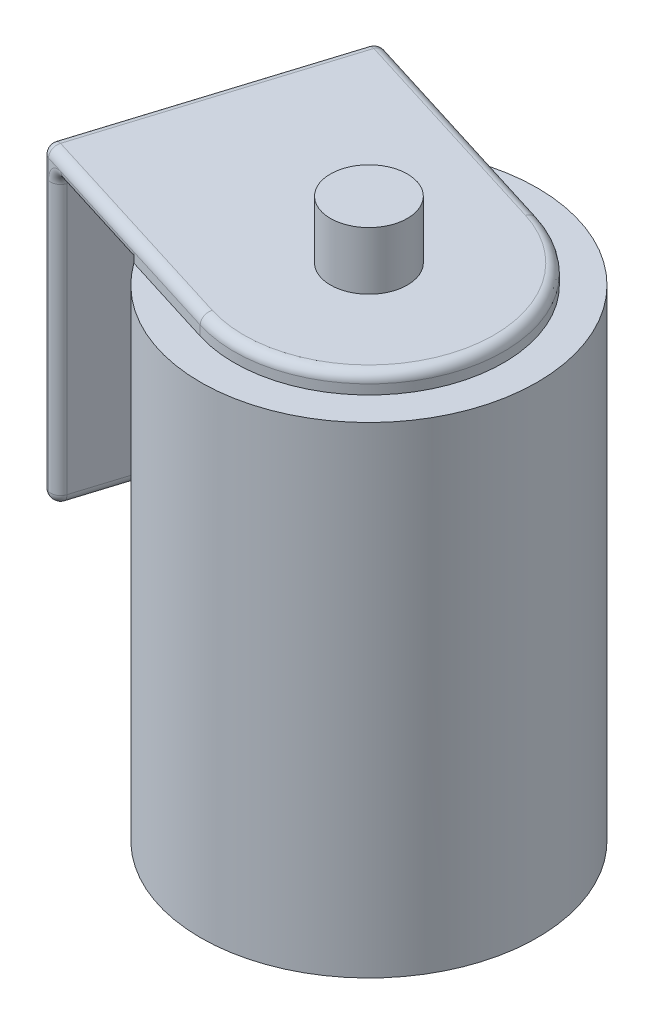
ISO-10303-21;
HEADER;
FILE_DESCRIPTION(('STEP AP214'),'2;1');
FILE_NAME('part.step','',(''),(''),'','','');
FILE_SCHEMA(('AUTOMOTIVE_DESIGN { 1 0 10303 214 1 1 1 1 }'));
ENDSEC;
DATA;
#1=APPLICATION_CONTEXT('core data for automotive mechanical design processes');
#2=APPLICATION_PROTOCOL_DEFINITION('international standard','automotive_design',2000,#1);
#3=PRODUCT_CONTEXT('',#1,'mechanical');
#4=PRODUCT('Part','Part','',(#3));
#5=PRODUCT_RELATED_PRODUCT_CATEGORY('part','',(#4));
#6=PRODUCT_DEFINITION_FORMATION('','',#4);
#7=PRODUCT_DEFINITION_CONTEXT('part definition',#1,'design');
#8=PRODUCT_DEFINITION('design','',#6,#7);
#9=PRODUCT_DEFINITION_SHAPE('','',#8);
#10=(LENGTH_UNIT() NAMED_UNIT(*) SI_UNIT(.MILLI.,.METRE.));
#11=(NAMED_UNIT(*) PLANE_ANGLE_UNIT() SI_UNIT($,.RADIAN.));
#12=(NAMED_UNIT(*) SI_UNIT($,.STERADIAN.) SOLID_ANGLE_UNIT());
#13=UNCERTAINTY_MEASURE_WITH_UNIT(LENGTH_MEASURE(1.E-05),#10,'distance_accuracy_value','');
#14=(GEOMETRIC_REPRESENTATION_CONTEXT(3) GLOBAL_UNCERTAINTY_ASSIGNED_CONTEXT((#13)) GLOBAL_UNIT_ASSIGNED_CONTEXT((#10,
#11,#12)) REPRESENTATION_CONTEXT('',''));
#15=CARTESIAN_POINT('',(0.,0.,0.));
#16=DIRECTION('',(0.,0.,1.));
#17=DIRECTION('',(1.,0.,0.));
#18=AXIS2_PLACEMENT_3D('',#15,#16,#17);
#19=CARTESIAN_POINT('',(-4.1677224270147,52.,13.3652568165134));
#20=DIRECTION('',(0.297694459072478,0.,-0.954661201179531));
#21=DIRECTION('',(-0.954661201179531,0.,-0.297694459072478));
#22=AXIS2_PLACEMENT_3D('',#19,#20,#21);
#23=PLANE('',#22);
#24=DIRECTION('',(0.954661201179531,0.,0.297694459072478));
#25=VECTOR('',#24,1.);
#26=CARTESIAN_POINT('',(-27.0795912553234,51.,6.22058979877396));
#27=LINE('',#26,#25);
#28=CARTESIAN_POINT('',(-4.1677224270147,51.,13.3652568165134));
#29=VERTEX_POINT('',#28);
#30=CARTESIAN_POINT('',(-14.1916650393998,51.,10.2394649962524));
#31=VERTEX_POINT('',#30);
#32=EDGE_CURVE('E192',#29,#31,#27,.F.);
#33=ORIENTED_EDGE('',*,*,#32,.T.);
#34=DIRECTION('',(0.,-1.,0.));
#35=VECTOR('',#34,1.);
#36=CARTESIAN_POINT('',(-14.1916650393998,51.,10.2394649962524));
#37=LINE('',#36,#35);
#38=CARTESIAN_POINT('',(-14.1916650393998,50.,10.2394649962524));
#39=VERTEX_POINT('',#38);
#40=EDGE_CURVE('E176',#31,#39,#37,.T.);
#41=ORIENTED_EDGE('',*,*,#40,.T.);
#42=DIRECTION('',(0.954661201179531,0.,0.297694459072478));
#43=VECTOR('',#42,1.);
#44=CARTESIAN_POINT('',(-4.1677224270147,50.,13.3652568165134));
#45=LINE('',#44,#43);
#46=CARTESIAN_POINT('',(-4.1677224270147,50.,13.3652568165134));
#47=VERTEX_POINT('',#46);
#48=EDGE_CURVE('E262',#39,#47,#45,.T.);
#49=ORIENTED_EDGE('',*,*,#48,.T.);
#50=DIRECTION('',(0.,-1.,0.));
#51=VECTOR('',#50,1.);
#52=CARTESIAN_POINT('',(-4.1677224270147,52.,13.3652568165134));
#53=LINE('',#52,#51);
#54=EDGE_CURVE('E267',#29,#47,#53,.T.);
#55=ORIENTED_EDGE('',*,*,#54,.F.);
#56=EDGE_LOOP('',(#33,#41,#49,#55));
#57=FACE_BOUND('',#56,.T.);
#58=ADVANCED_FACE('F34',(#57),#23,.F.);
#59=CARTESIAN_POINT('',(4.1677224270147,52.,-13.3652568165134));
#60=DIRECTION('',(-0.297694459072478,0.,0.954661201179531));
#61=DIRECTION('',(0.954661201179531,0.,0.297694459072478));
#62=AXIS2_PLACEMENT_3D('',#59,#60,#61);
#63=PLANE('',#62);
#64=CARTESIAN_POINT('',(-16.834823998935,49.,-19.9145349161079));
#65=DIRECTION('',(-0.297694459072478,0.,0.954661201179531));
#66=DIRECTION('',(0.954661201179531,0.,0.297694459072478));
#67=AXIS2_PLACEMENT_3D('',#64,#65,#66);
#68=CIRCLE('',#67,2.);
#69=CARTESIAN_POINT('',(-18.7441464012941,49.,-20.5099238342529));
#70=VERTEX_POINT('',#69);
#71=CARTESIAN_POINT('',(-16.834823998935,51.,-19.9145349161079));
#72=VERTEX_POINT('',#71);
#73=EDGE_CURVE('E298',#70,#72,#68,.F.);
#74=ORIENTED_EDGE('',*,*,#73,.F.);
#75=DIRECTION('',(0.,-1.,0.));
#76=VECTOR('',#75,1.);
#77=CARTESIAN_POINT('',(-18.7441464012941,52.,-20.5099238342529));
#78=LINE('',#77,#76);
#79=CARTESIAN_POINT('',(-18.7441464012941,51.,-20.5099238342529));
#80=VERTEX_POINT('',#79);
#81=EDGE_CURVE('E296',#70,#80,#78,.F.);
#82=ORIENTED_EDGE('',*,*,#81,.T.);
#83=DIRECTION('',(-0.954661201179531,0.,-0.297694459072478));
#84=VECTOR('',#83,1.);
#85=CARTESIAN_POINT('',(4.1677224270147,51.,-13.3652568165134));
#86=LINE('',#85,#84);
#87=EDGE_CURVE('E294',#80,#72,#86,.F.);
#88=ORIENTED_EDGE('',*,*,#87,.T.);
#89=EDGE_LOOP('',(#74,#82,#88));
#90=FACE_BOUND('',#89,.T.);
#91=ADVANCED_FACE('F376',(#90),#63,.F.);
#92=CARTESIAN_POINT('',(0.,50.,0.));
#93=DIRECTION('',(0.,1.,0.));
#94=DIRECTION('',(0.,0.,1.));
#95=AXIS2_PLACEMENT_3D('',#92,#93,#94);
#96=PLANE('',#95);
#97=DIRECTION('',(-0.297694459072478,0.,0.954661201179531));
#98=VECTOR('',#97,1.);
#99=CARTESIAN_POINT('',(-16.834823998935,50.,-19.9145349161079));
#100=LINE('',#99,#98);
#101=CARTESIAN_POINT('',(-24.8725743938919,50.,5.86131751573939));
#102=VERTEX_POINT('',#101);
#103=CARTESIAN_POINT('',(-17.1325184580075,50.,-18.9598737149284));
#104=VERTEX_POINT('',#103);
#105=EDGE_CURVE('E302',#102,#104,#100,.F.);
#106=ORIENTED_EDGE('',*,*,#105,.T.);
#107=DIRECTION('',(-0.954661201179531,0.,-0.297694459072478));
#108=VECTOR('',#107,1.);
#109=CARTESIAN_POINT('',(3.87002796794221,50.,-12.4105956153339));
#110=LINE('',#109,#108);
#111=CARTESIAN_POINT('',(-7.31418553772742,50.,-15.8981976940689));
#112=VERTEX_POINT('',#111);
#113=EDGE_CURVE('E304',#104,#112,#110,.F.);
#114=ORIENTED_EDGE('',*,*,#113,.T.);
#115=CARTESIAN_POINT('',(0.,50.,0.));
#116=DIRECTION('',(0.,1.,0.));
#117=DIRECTION('',(0.,0.,1.));
#118=AXIS2_PLACEMENT_3D('',#115,#116,#117);
#119=CIRCLE('',#118,17.5);
#120=CARTESIAN_POINT('',(-15.0542414736119,50.,8.92299353659886));
#121=VERTEX_POINT('',#120);
#122=EDGE_CURVE('E275',#112,#121,#119,.T.);
#123=ORIENTED_EDGE('',*,*,#122,.T.);
#124=DIRECTION('',(0.954661201179531,0.,0.297694459072478));
#125=VECTOR('',#124,1.);
#126=CARTESIAN_POINT('',(-3.87002796794221,50.,12.4105956153339));
#127=LINE('',#126,#125);
#128=EDGE_CURVE('E300',#121,#102,#127,.F.);
#129=ORIENTED_EDGE('',*,*,#128,.T.);
#130=EDGE_LOOP('',(#106,#114,#123,#129));
#131=FACE_BOUND('',#130,.T.);
#132=ADVANCED_FACE('F383',(#131),#96,.F.);
#133=CARTESIAN_POINT('',(0.,50.,0.));
#134=DIRECTION('',(0.,1.,0.));
#135=DIRECTION('',(0.,0.,1.));
#136=AXIS2_PLACEMENT_3D('',#133,#134,#135);
#137=PLANE('',#136);
#138=CARTESIAN_POINT('',(-5.85622018537039,50.,-16.4910486367745));
#139=VERTEX_POINT('',#138);
#140=EDGE_CURVE('E278',#39,#139,#119,.T.);
#141=ORIENTED_EDGE('',*,*,#140,.T.);
#142=DIRECTION('',(-0.954661201179531,0.,-0.297694459072478));
#143=VECTOR('',#142,1.);
#144=CARTESIAN_POINT('',(4.1677224270147,50.,-13.3652568165134));
#145=LINE('',#144,#143);
#146=CARTESIAN_POINT('',(4.1677224270147,50.,-13.3652568165134));
#147=VERTEX_POINT('',#146);
#148=EDGE_CURVE('E257',#147,#139,#145,.T.);
#149=ORIENTED_EDGE('',*,*,#148,.F.);
#150=CARTESIAN_POINT('',(0.,50.,0.));
#151=DIRECTION('',(0.,1.,0.));
#152=DIRECTION('',(0.,0.,1.));
#153=AXIS2_PLACEMENT_3D('',#150,#151,#152);
#154=CIRCLE('',#153,14.);
#155=EDGE_CURVE('E251',#47,#147,#154,.T.);
#156=ORIENTED_EDGE('',*,*,#155,.F.);
#157=ORIENTED_EDGE('',*,*,#48,.F.);
#158=EDGE_LOOP('',(#141,#149,#156,#157));
#159=FACE_BOUND('',#158,.T.);
#160=ADVANCED_FACE('F447',(#159),#137,.T.);
#161=CARTESIAN_POINT('',(0.,50.,0.));
#162=DIRECTION('',(0.,-1.,0.));
#163=DIRECTION('',(0.,0.,-1.));
#164=AXIS2_PLACEMENT_3D('',#161,#162,#163);
#165=CYLINDRICAL_SURFACE('',#164,17.5);
#166=ORIENTED_EDGE('',*,*,#122,.F.);
#167=CARTESIAN_POINT('',(-7.31418553772742,50.,-15.8981976940689));
#168=CARTESIAN_POINT('',(-7.25705568160433,50.0000194316318,-15.9244846146867));
#169=CARTESIAN_POINT('',(-7.19978611132749,50.0026593719375,-15.9504556904162));
#170=CARTESIAN_POINT('',(-7.0853049212149,50.0131318772669,-16.0016361680488));
#171=CARTESIAN_POINT('',(-7.02809343482837,50.0209701624678,-16.0268446988725));
#172=CARTESIAN_POINT('',(-6.91358931206007,50.0419011324179,-16.0765738536952));
#173=CARTESIAN_POINT('',(-6.85630225401496,50.0550486791275,-16.1010843423905));
#174=CARTESIAN_POINT('',(-6.74277323141341,50.0866861633452,-16.1489566799779));
#175=CARTESIAN_POINT('',(-6.68653066313799,50.1051729055764,-16.1723192061197));
#176=CARTESIAN_POINT('',(-6.55785839777105,50.1545332891975,-16.2250035288217));
#177=CARTESIAN_POINT('',(-6.48600748161506,50.1874776797234,-16.2538402311197));
#178=CARTESIAN_POINT('',(-6.34714922786583,50.2639760210325,-16.3085627686919));
#179=CARTESIAN_POINT('',(-6.28012608471317,50.3074931002652,-16.3344584098489));
#180=CARTESIAN_POINT('',(-6.1754961653331,50.3898370998605,-16.3742251250194));
#181=CARTESIAN_POINT('',(-6.13562548054549,50.4252438715386,-16.3891945462521));
#182=CARTESIAN_POINT('',(-6.0609771638214,50.5018949632079,-16.4169464028576));
#183=CARTESIAN_POINT('',(-6.02619413421924,50.5431330038687,-16.429731158476));
#184=CARTESIAN_POINT('',(-5.97206321033895,50.6203156432599,-16.4494702795847));
#185=CARTESIAN_POINT('',(-5.95104374260998,50.6549109196775,-16.4570792786156));
#186=CARTESIAN_POINT('',(-5.91447538142288,50.7271714307816,-16.4702567194301));
#187=CARTESIAN_POINT('',(-5.89890862399719,50.7648261331324,-16.4758318271127));
#188=CARTESIAN_POINT('',(-5.87687041847779,50.8351704555192,-16.4837044294374));
#189=CARTESIAN_POINT('',(-5.86923288760483,50.867444300483,-16.4864233850948));
#190=CARTESIAN_POINT('',(-5.85885794288661,50.9331161300893,-16.4901119870734));
#191=CARTESIAN_POINT('',(-5.85615917137328,50.9665209141301,-16.4910678387988));
#192=CARTESIAN_POINT('',(-5.85622018537039,51.,-16.4910486367745));
#193=B_SPLINE_CURVE_WITH_KNOTS('',3,(#167,#168,#169,#170,#171,#172,#173,#174,#175,#176,#177,
#178,#179,#180,#181,#182,#183,#184,#185,#186,#187,#188,#189,#190,#191,#192),.UNSPECIFIED.,.F.,
.F.,(4,2,2,2,2,2,2,2,2,2,2,2,4),(0.,0.188599903533923,0.377407684546077,0.568218536267798,
0.758915431754201,1.01062978002771,1.26147858373347,1.42719784876224,1.59274000110155,
1.71588383025827,1.83862036150482,1.93803950092394,2.03823325297878),.UNSPECIFIED.);
#194=CARTESIAN_POINT('',(-5.85622018537039,51.,-16.4910486367745));
#195=VERTEX_POINT('',#194);
#196=EDGE_CURVE('E44',#112,#195,#193,.T.);
#197=ORIENTED_EDGE('',*,*,#196,.T.);
#198=DIRECTION('',(0.,-1.,0.));
#199=VECTOR('',#198,1.);
#200=CARTESIAN_POINT('',(-5.85622018537039,50.,-16.4910486367745));
#201=LINE('',#200,#199);
#202=EDGE_CURVE('E53',#139,#195,#201,.F.);
#203=ORIENTED_EDGE('',*,*,#202,.F.);
#204=ORIENTED_EDGE('',*,*,#140,.F.);
#205=ORIENTED_EDGE('',*,*,#40,.F.);
#206=CARTESIAN_POINT('',(-14.1916650393998,51.,10.2394649962524));
#207=CARTESIAN_POINT('',(-14.1916604912195,50.9792342518175,10.239470722701));
#208=CARTESIAN_POINT('',(-14.1922964227419,50.958484309259,10.2385899520087));
#209=CARTESIAN_POINT('',(-14.1948021888356,50.9172312915766,10.2351159270866));
#210=CARTESIAN_POINT('',(-14.1966703296728,50.896727916868,10.2325250235174));
#211=CARTESIAN_POINT('',(-14.2039900084243,50.8363631011334,10.2223646358463));
#212=CARTESIAN_POINT('',(-14.211159545104,50.7970865350795,10.2124039050856));
#213=CARTESIAN_POINT('',(-14.2292856258553,50.7215521464888,10.1871323285089));
#214=CARTESIAN_POINT('',(-14.2402228073106,50.685280043327,10.1718488330227));
#215=CARTESIAN_POINT('',(-14.2650623230422,50.6158489827012,10.1369847045877));
#216=CARTESIAN_POINT('',(-14.2789747598772,50.5827012007651,10.1173894241312));
#217=CARTESIAN_POINT('',(-14.3176921644854,50.5014402207271,10.0625722745492));
#218=CARTESIAN_POINT('',(-14.3441369689717,50.4557876362046,10.0248757048982));
#219=CARTESIAN_POINT('',(-14.4003520588701,50.3721079940234,9.94395877909832));
#220=CARTESIAN_POINT('',(-14.4301299960043,50.3340990665512,9.90072567881857));
#221=CARTESIAN_POINT('',(-14.5088167079772,50.2456545520881,9.78526556746109));
#222=CARTESIAN_POINT('',(-14.5591483871522,50.2000776066314,9.71029432628928));
#223=CARTESIAN_POINT('',(-14.6618007758925,50.123285176311,9.55459940029215));
#224=CARTESIAN_POINT('',(-14.7141254534176,50.0921001576204,9.47386392631548));
#225=CARTESIAN_POINT('',(-14.8149915954165,50.0450567810736,9.31526346155012));
#226=CARTESIAN_POINT('',(-14.8635028081865,50.0281763381882,9.23768122124313));
#227=CARTESIAN_POINT('',(-14.9356732485985,50.0112932334518,9.12018462439781));
#228=CARTESIAN_POINT('',(-14.9595507922229,50.0070719905037,9.08096658876637));
#229=CARTESIAN_POINT('',(-15.0070827745196,50.001428226676,9.00219886079975));
#230=CARTESIAN_POINT('',(-15.0307372262493,50.0000055409738,8.96264918813433));
#231=CARTESIAN_POINT('',(-15.0542414736119,50.,8.92299353659886));
#232=B_SPLINE_CURVE_WITH_KNOTS('',3,(#206,#207,#208,#209,#210,#211,#212,#213,#214,#215,#216,
#217,#218,#219,#220,#221,#222,#223,#224,#225,#226,#227,#228,#229,#230,#231),.UNSPECIFIED.,.F.,
.F.,(4,2,2,2,2,2,2,2,2,2,2,2,4),(0.,0.0622398212713831,0.124394268553072,0.247052618623898,
0.369089783757822,0.491548102167956,0.684978199355718,0.878861823046949,1.18066119611772,
1.4830965483778,1.76146749951544,1.89971961346226,2.0379635847233),.UNSPECIFIED.);
#233=EDGE_CURVE('E11',#31,#121,#232,.T.);
#234=ORIENTED_EDGE('',*,*,#233,.T.);
#235=EDGE_LOOP('',(#166,#197,#203,#204,#205,#234));
#236=FACE_BOUND('',#235,.T.);
#237=CARTESIAN_POINT('',(0.,0.,0.));
#238=DIRECTION('',(0.,1.,0.));
#239=DIRECTION('',(0.,0.,1.));
#240=AXIS2_PLACEMENT_3D('',#237,#238,#239);
#241=CIRCLE('',#240,17.5);
#242=CARTESIAN_POINT('',(0.,0.,17.5));
#243=VERTEX_POINT('',#242);
#244=EDGE_CURVE('E274',#243,#243,#241,.T.);
#245=ORIENTED_EDGE('',*,*,#244,.T.);
#246=EDGE_LOOP('',(#245));
#247=FACE_BOUND('',#246,.T.);
#248=ADVANCED_FACE('F347',(#236,#247),#165,.T.);
#249=CARTESIAN_POINT('',(0.,0.,0.));
#250=DIRECTION('',(0.,1.,0.));
#251=DIRECTION('',(0.,0.,1.));
#252=AXIS2_PLACEMENT_3D('',#249,#250,#251);
#253=PLANE('',#252);
#254=ORIENTED_EDGE('',*,*,#244,.F.);
#255=EDGE_LOOP('',(#254));
#256=FACE_BOUND('',#255,.T.);
#257=ADVANCED_FACE('F510',(#256),#253,.F.);
#258=CARTESIAN_POINT('',(0.,52.,0.));
#259=DIRECTION('',(0.,-1.,0.));
#260=DIRECTION('',(0.,0.,-1.));
#261=AXIS2_PLACEMENT_3D('',#258,#259,#260);
#262=CYLINDRICAL_SURFACE('',#261,14.);
#263=DIRECTION('',(0.,-1.,0.));
#264=VECTOR('',#263,1.);
#265=CARTESIAN_POINT('',(4.1677224270147,52.,-13.3652568165134));
#266=LINE('',#265,#264);
#267=CARTESIAN_POINT('',(4.1677224270147,51.,-13.3652568165134));
#268=VERTEX_POINT('',#267);
#269=EDGE_CURVE('E85',#268,#147,#266,.T.);
#270=ORIENTED_EDGE('',*,*,#269,.F.);
#271=CARTESIAN_POINT('',(0.,51.,0.));
#272=DIRECTION('',(0.,1.,0.));
#273=DIRECTION('',(0.,0.,1.));
#274=AXIS2_PLACEMENT_3D('',#271,#272,#273);
#275=CIRCLE('',#274,14.);
#276=EDGE_CURVE('E333',#268,#29,#275,.F.);
#277=ORIENTED_EDGE('',*,*,#276,.T.);
#278=ORIENTED_EDGE('',*,*,#54,.T.);
#279=ORIENTED_EDGE('',*,*,#155,.T.);
#280=EDGE_LOOP('',(#270,#277,#278,#279));
#281=FACE_BOUND('',#280,.T.);
#282=ADVANCED_FACE('F449',(#281),#262,.T.);
#283=ORIENTED_EDGE('',*,*,#148,.T.);
#284=ORIENTED_EDGE('',*,*,#202,.T.);
#285=DIRECTION('',(-0.954661201179531,0.,-0.297694459072478));
#286=VECTOR('',#285,1.);
#287=CARTESIAN_POINT('',(4.1677224270147,51.,-13.3652568165134));
#288=LINE('',#287,#286);
#289=EDGE_CURVE('E291',#195,#268,#288,.F.);
#290=ORIENTED_EDGE('',*,*,#289,.T.);
#291=ORIENTED_EDGE('',*,*,#269,.T.);
#292=EDGE_LOOP('',(#283,#284,#290,#291));
#293=FACE_BOUND('',#292,.T.);
#294=ADVANCED_FACE('F386',(#293),#63,.F.);
#295=CARTESIAN_POINT('',(-19.6988076024736,52.,-20.8076182933254));
#296=DIRECTION('',(0.954661201179531,0.,0.297694459072478));
#297=DIRECTION('',(0.297694459072478,0.,-0.954661201179531));
#298=AXIS2_PLACEMENT_3D('',#295,#296,#297);
#299=PLANE('',#298);
#300=DIRECTION('',(-0.297694459072478,0.,0.954661201179531));
#301=VECTOR('',#300,1.);
#302=CARTESIAN_POINT('',(-19.6988076024736,51.,-20.8076182933254));
#303=LINE('',#302,#301);
#304=CARTESIAN_POINT('',(-27.7365579974305,51.,4.96823413852196));
#305=VERTEX_POINT('',#304);
#306=CARTESIAN_POINT('',(-19.9965020615461,51.,-19.8529570921459));
#307=VERTEX_POINT('',#306);
#308=EDGE_CURVE('E284',#305,#307,#303,.F.);
#309=ORIENTED_EDGE('',*,*,#308,.T.);
#310=DIRECTION('',(0.,-1.,0.));
#311=VECTOR('',#310,1.);
#312=CARTESIAN_POINT('',(-19.9965020615461,52.,-19.8529570921459));
#313=LINE('',#312,#311);
#314=CARTESIAN_POINT('',(-19.9965020615461,21.,-19.8529570921459));
#315=VERTEX_POINT('',#314);
#316=EDGE_CURVE('E311',#307,#315,#313,.T.);
#317=ORIENTED_EDGE('',*,*,#316,.T.);
#318=DIRECTION('',(0.297694459072478,0.,-0.954661201179531));
#319=VECTOR('',#318,1.);
#320=CARTESIAN_POINT('',(-19.6988076024736,21.,-20.8076182933254));
#321=LINE('',#320,#319);
#322=CARTESIAN_POINT('',(-27.7365579974305,21.,4.96823413852196));
#323=VERTEX_POINT('',#322);
#324=EDGE_CURVE('E309',#315,#323,#321,.F.);
#325=ORIENTED_EDGE('',*,*,#324,.T.);
#326=DIRECTION('',(0.,-1.,0.));
#327=VECTOR('',#326,1.);
#328=CARTESIAN_POINT('',(-27.7365579974305,52.,4.96823413852196));
#329=LINE('',#328,#327);
#330=EDGE_CURVE('E307',#323,#305,#329,.F.);
#331=ORIENTED_EDGE('',*,*,#330,.T.);
#332=EDGE_LOOP('',(#309,#317,#325,#331));
#333=FACE_BOUND('',#332,.T.);
#334=ADVANCED_FACE('F390',(#333),#299,.F.);
#335=DIRECTION('',(0.954661201179531,0.,0.297694459072478));
#336=VECTOR('',#335,1.);
#337=CARTESIAN_POINT('',(-27.0795912553234,51.,6.22058979877396));
#338=LINE('',#337,#336);
#339=CARTESIAN_POINT('',(-25.1702688529644,51.,6.81597871691892));
#340=VERTEX_POINT('',#339);
#341=CARTESIAN_POINT('',(-27.0795912553234,51.,6.22058979877396));
#342=VERTEX_POINT('',#341);
#343=EDGE_CURVE('E322',#340,#342,#338,.F.);
#344=ORIENTED_EDGE('',*,*,#343,.T.);
#345=DIRECTION('',(0.,-1.,0.));
#346=VECTOR('',#345,1.);
#347=CARTESIAN_POINT('',(-27.0795912553234,52.,6.22058979877396));
#348=LINE('',#347,#346);
#349=CARTESIAN_POINT('',(-27.0795912553234,49.,6.22058979877396));
#350=VERTEX_POINT('',#349);
#351=EDGE_CURVE('E327',#342,#350,#348,.T.);
#352=ORIENTED_EDGE('',*,*,#351,.T.);
#353=CARTESIAN_POINT('',(-25.1702688529644,49.,6.81597871691892));
#354=DIRECTION('',(0.297694459072478,0.,-0.954661201179531));
#355=DIRECTION('',(-0.954661201179531,0.,-0.297694459072478));
#356=AXIS2_PLACEMENT_3D('',#353,#354,#355);
#357=CIRCLE('',#356,2.);
#358=EDGE_CURVE('E324',#340,#350,#357,.F.);
#359=ORIENTED_EDGE('',*,*,#358,.F.);
#360=EDGE_LOOP('',(#344,#352,#359));
#361=FACE_BOUND('',#360,.T.);
#362=ADVANCED_FACE('F379',(#361),#23,.F.);
#363=CARTESIAN_POINT('',(0.,52.,0.));
#364=DIRECTION('',(0.,1.,0.));
#365=DIRECTION('',(0.,0.,1.));
#366=AXIS2_PLACEMENT_3D('',#363,#364,#365);
#367=PLANE('',#366);
#368=CARTESIAN_POINT('',(0.,52.,0.));
#369=DIRECTION('',(0.,1.,0.));
#370=DIRECTION('',(0.,0.,1.));
#371=AXIS2_PLACEMENT_3D('',#368,#369,#370);
#372=CIRCLE('',#371,4.);
#373=CARTESIAN_POINT('',(0.,52.,4.));
#374=VERTEX_POINT('',#373);
#375=EDGE_CURVE('E270',#374,#374,#372,.T.);
#376=ORIENTED_EDGE('',*,*,#375,.F.);
#377=EDGE_LOOP('',(#376));
#378=FACE_BOUND('',#377,.T.);
#379=CARTESIAN_POINT('',(0.,52.,0.));
#380=DIRECTION('',(0.,1.,0.));
#381=DIRECTION('',(0.,0.,1.));
#382=AXIS2_PLACEMENT_3D('',#379,#380,#381);
#383=CIRCLE('',#382,13.);
#384=CARTESIAN_POINT('',(-3.87002796794222,52.,12.4105956153339));
#385=VERTEX_POINT('',#384);
#386=CARTESIAN_POINT('',(3.87002796794222,52.,-12.4105956153339));
#387=VERTEX_POINT('',#386);
#388=EDGE_CURVE('E168',#385,#387,#383,.T.);
#389=ORIENTED_EDGE('',*,*,#388,.T.);
#390=DIRECTION('',(-0.954661201179531,0.,-0.297694459072478));
#391=VECTOR('',#390,1.);
#392=CARTESIAN_POINT('',(-19.0418408603665,52.,-19.5552626330734));
#393=LINE('',#392,#391);
#394=CARTESIAN_POINT('',(-19.0418408603665,52.,-19.5552626330734));
#395=VERTEX_POINT('',#394);
#396=EDGE_CURVE('E187',#387,#395,#393,.T.);
#397=ORIENTED_EDGE('',*,*,#396,.T.);
#398=DIRECTION('',(-0.297694459072478,0.,0.954661201179531));
#399=VECTOR('',#398,1.);
#400=CARTESIAN_POINT('',(-27.0795912553234,52.,6.22058979877397));
#401=LINE('',#400,#399);
#402=CARTESIAN_POINT('',(-26.781896796251,52.,5.26592859759443));
#403=VERTEX_POINT('',#402);
#404=EDGE_CURVE('E171',#395,#403,#401,.T.);
#405=ORIENTED_EDGE('',*,*,#404,.T.);
#406=DIRECTION('',(0.954661201179531,0.,0.297694459072478));
#407=VECTOR('',#406,1.);
#408=CARTESIAN_POINT('',(-3.87002796794222,52.,12.4105956153339));
#409=LINE('',#408,#407);
#410=EDGE_CURVE('E165',#403,#385,#409,.T.);
#411=ORIENTED_EDGE('',*,*,#410,.T.);
#412=EDGE_LOOP('',(#389,#397,#405,#411));
#413=FACE_BOUND('',#412,.T.);
#414=ADVANCED_FACE('F167',(#378,#413),#367,.T.);
#415=CARTESIAN_POINT('',(0.,58.,0.));
#416=DIRECTION('',(0.,1.,0.));
#417=DIRECTION('',(0.,0.,1.));
#418=AXIS2_PLACEMENT_3D('',#415,#416,#417);
#419=PLANE('',#418);
#420=CARTESIAN_POINT('',(0.,58.,0.));
#421=DIRECTION('',(0.,1.,0.));
#422=DIRECTION('',(0.,0.,1.));
#423=AXIS2_PLACEMENT_3D('',#420,#421,#422);
#424=CIRCLE('',#423,4.);
#425=CARTESIAN_POINT('',(0.,58.,4.));
#426=VERTEX_POINT('',#425);
#427=EDGE_CURVE('E271',#426,#426,#424,.T.);
#428=ORIENTED_EDGE('',*,*,#427,.T.);
#429=EDGE_LOOP('',(#428));
#430=FACE_BOUND('',#429,.T.);
#431=ADVANCED_FACE('F396',(#430),#419,.T.);
#432=CARTESIAN_POINT('',(0.,58.,0.));
#433=DIRECTION('',(0.,-1.,0.));
#434=DIRECTION('',(0.,0.,-1.));
#435=AXIS2_PLACEMENT_3D('',#432,#433,#434);
#436=CYLINDRICAL_SURFACE('',#435,4.);
#437=ORIENTED_EDGE('',*,*,#375,.T.);
#438=EDGE_LOOP('',(#437));
#439=FACE_BOUND('',#438,.T.);
#440=ORIENTED_EDGE('',*,*,#427,.F.);
#441=EDGE_LOOP('',(#440));
#442=FACE_BOUND('',#441,.T.);
#443=ADVANCED_FACE('F494',(#439,#442),#436,.T.);
#444=CARTESIAN_POINT('',(-26.1249300541439,20.,6.51828425784644));
#445=DIRECTION('',(-0.954661201179531,0.,-0.297694459072478));
#446=DIRECTION('',(-0.297694459072478,0.,0.954661201179531));
#447=AXIS2_PLACEMENT_3D('',#444,#445,#446);
#448=PLANE('',#447);
#449=DIRECTION('',(-0.297694459072478,0.,0.954661201179531));
#450=VECTOR('',#449,1.);
#451=CARTESIAN_POINT('',(-26.1249300541439,21.,6.51828425784644));
#452=LINE('',#451,#450);
#453=CARTESIAN_POINT('',(-25.8272355950714,21.,5.56362305666691));
#454=VERTEX_POINT('',#453);
#455=CARTESIAN_POINT('',(-18.087179659187,21.,-19.2575681740009));
#456=VERTEX_POINT('',#455);
#457=EDGE_CURVE('E315',#454,#456,#452,.F.);
#458=ORIENTED_EDGE('',*,*,#457,.T.);
#459=DIRECTION('',(0.,1.,0.));
#460=VECTOR('',#459,1.);
#461=CARTESIAN_POINT('',(-18.087179659187,20.,-19.2575681740009));
#462=LINE('',#461,#460);
#463=CARTESIAN_POINT('',(-18.087179659187,49.,-19.2575681740009));
#464=VERTEX_POINT('',#463);
#465=EDGE_CURVE('E319',#456,#464,#462,.T.);
#466=ORIENTED_EDGE('',*,*,#465,.T.);
#467=DIRECTION('',(-0.297694459072478,0.,0.954661201179531));
#468=VECTOR('',#467,1.);
#469=CARTESIAN_POINT('',(-26.1249300541439,49.,6.51828425784644));
#470=LINE('',#469,#468);
#471=CARTESIAN_POINT('',(-25.8272355950714,49.,5.56362305666691));
#472=VERTEX_POINT('',#471);
#473=EDGE_CURVE('E317',#464,#472,#470,.T.);
#474=ORIENTED_EDGE('',*,*,#473,.T.);
#475=DIRECTION('',(0.,1.,0.));
#476=VECTOR('',#475,1.);
#477=CARTESIAN_POINT('',(-25.8272355950714,20.,5.56362305666691));
#478=LINE('',#477,#476);
#479=EDGE_CURVE('E313',#472,#454,#478,.F.);
#480=ORIENTED_EDGE('',*,*,#479,.T.);
#481=EDGE_LOOP('',(#458,#466,#474,#480));
#482=FACE_BOUND('',#481,.T.);
#483=ADVANCED_FACE('F492',(#482),#448,.F.);
#484=CARTESIAN_POINT('',(-22.9118688283087,51.,-7.14466701773947));
#485=DIRECTION('',(0.297694459072478,0.,-0.954661201179531));
#486=DIRECTION('',(-0.954661201179531,0.,-0.297694459072478));
#487=AXIS2_PLACEMENT_3D('',#484,#485,#486);
#488=CYLINDRICAL_SURFACE('',#487,1.);
#489=ORIENTED_EDGE('',*,*,#308,.F.);
#490=CARTESIAN_POINT('',(-26.781896796251,51.,5.26592859759443));
#491=DIRECTION('',(0.297694459072478,0.,-0.954661201179531));
#492=DIRECTION('',(-0.954661201179531,0.,-0.297694459072478));
#493=AXIS2_PLACEMENT_3D('',#490,#491,#492);
#494=CIRCLE('',#493,1.);
#495=EDGE_CURVE('E289',#305,#403,#494,.T.);
#496=ORIENTED_EDGE('',*,*,#495,.T.);
#497=ORIENTED_EDGE('',*,*,#404,.F.);
#498=CARTESIAN_POINT('',(-19.0418408603665,51.,-19.5552626330734));
#499=DIRECTION('',(0.297694459072478,0.,-0.954661201179531));
#500=DIRECTION('',(-0.954661201179531,0.,-0.297694459072478));
#501=AXIS2_PLACEMENT_3D('',#498,#499,#500);
#502=CIRCLE('',#501,1.);
#503=EDGE_CURVE('E287',#395,#307,#502,.F.);
#504=ORIENTED_EDGE('',*,*,#503,.T.);
#505=EDGE_LOOP('',(#489,#496,#497,#504));
#506=FACE_BOUND('',#505,.T.);
#507=ADVANCED_FACE('F374',(#506),#488,.T.);
#508=CARTESIAN_POINT('',(-19.0418408603665,20.,-19.5552626330734));
#509=DIRECTION('',(0.,1.,0.));
#510=DIRECTION('',(0.,0.,1.));
#511=AXIS2_PLACEMENT_3D('',#508,#509,#510);
#512=CYLINDRICAL_SURFACE('',#511,1.);
#513=DIRECTION('',(0.,1.,0.));
#514=VECTOR('',#513,1.);
#515=CARTESIAN_POINT('',(-18.7441464012941,52.,-20.5099238342529));
#516=LINE('',#515,#514);
#517=CARTESIAN_POINT('',(-18.7441464012941,21.,-20.5099238342529));
#518=VERTEX_POINT('',#517);
#519=EDGE_CURVE('E246',#70,#518,#516,.F.);
#520=ORIENTED_EDGE('',*,*,#519,.F.);
#521=CARTESIAN_POINT('',(-19.0418408603665,49.,-19.5552626330734));
#522=DIRECTION('',(0.,1.,0.));
#523=DIRECTION('',(0.,0.,1.));
#524=AXIS2_PLACEMENT_3D('',#521,#522,#523);
#525=CIRCLE('',#524,1.);
#526=EDGE_CURVE('E38',#464,#70,#525,.T.);
#527=ORIENTED_EDGE('',*,*,#526,.F.);
#528=ORIENTED_EDGE('',*,*,#465,.F.);
#529=CARTESIAN_POINT('',(-19.0418408603665,21.,-19.5552626330734));
#530=DIRECTION('',(0.,-1.,0.));
#531=DIRECTION('',(0.,0.,-1.));
#532=AXIS2_PLACEMENT_3D('',#529,#530,#531);
#533=CIRCLE('',#532,1.);
#534=EDGE_CURVE('E78',#518,#456,#533,.T.);
#535=ORIENTED_EDGE('',*,*,#534,.F.);
#536=EDGE_LOOP('',(#520,#527,#528,#535));
#537=FACE_BOUND('',#536,.T.);
#538=ADVANCED_FACE('F36',(#537),#512,.T.);
#539=CARTESIAN_POINT('',(-17.1325184580075,49.,-18.9598737149284));
#540=DIRECTION('',(-0.297694459072478,0.,0.954661201179531));
#541=DIRECTION('',(0.954661201179531,0.,0.297694459072478));
#542=AXIS2_PLACEMENT_3D('',#539,#540,#541);
#543=TOROIDAL_SURFACE('',#542,2.,1.);
#544=ORIENTED_EDGE('',*,*,#526,.T.);
#545=ORIENTED_EDGE('',*,*,#73,.T.);
#546=CARTESIAN_POINT('',(-17.1325184580075,51.,-18.9598737149284));
#547=DIRECTION('',(-0.954661201179531,0.,-0.297694459072479));
#548=DIRECTION('',(-0.297694459072479,0.,0.954661201179531));
#549=AXIS2_PLACEMENT_3D('',#546,#547,#548);
#550=CIRCLE('',#549,1.);
#551=EDGE_CURVE('E240',#104,#72,#550,.F.);
#552=ORIENTED_EDGE('',*,*,#551,.F.);
#553=CARTESIAN_POINT('',(-17.1325184580075,49.,-18.9598737149284));
#554=DIRECTION('',(-0.297694459072478,0.,0.954661201179531));
#555=DIRECTION('',(0.954661201179531,0.,0.297694459072478));
#556=AXIS2_PLACEMENT_3D('',#553,#554,#555);
#557=CIRCLE('',#556,1.);
#558=EDGE_CURVE('E237',#464,#104,#557,.F.);
#559=ORIENTED_EDGE('',*,*,#558,.F.);
#560=EDGE_LOOP('',(#544,#545,#552,#559));
#561=FACE_BOUND('',#560,.T.);
#562=ADVANCED_FACE('F369',(#561),#543,.T.);
#563=CARTESIAN_POINT('',(-19.0418408603665,21.,-19.5552626330734));
#564=DIRECTION('',(0.,0.,1.));
#565=DIRECTION('',(1.,0.,0.));
#566=AXIS2_PLACEMENT_3D('',#563,#564,#565);
#567=SPHERICAL_SURFACE('',#566,1.);
#568=CARTESIAN_POINT('',(-19.0418408603665,21.,-19.5552626330734));
#569=DIRECTION('',(0.954661201179532,0.,0.297694459072476));
#570=DIRECTION('',(0.297694459072476,0.,-0.954661201179532));
#571=AXIS2_PLACEMENT_3D('',#568,#569,#570);
#572=CIRCLE('',#571,1.);
#573=CARTESIAN_POINT('',(-19.0418408603665,20.,-19.5552626330734));
#574=VERTEX_POINT('',#573);
#575=EDGE_CURVE('E249',#518,#574,#572,.F.);
#576=ORIENTED_EDGE('',*,*,#575,.F.);
#577=ORIENTED_EDGE('',*,*,#534,.T.);
#578=CARTESIAN_POINT('',(-19.0418408603665,21.,-19.5552626330734));
#579=DIRECTION('',(0.297694459072479,0.,-0.954661201179531));
#580=DIRECTION('',(-0.954661201179531,0.,-0.297694459072479));
#581=AXIS2_PLACEMENT_3D('',#578,#579,#580);
#582=CIRCLE('',#581,1.);
#583=EDGE_CURVE('E71',#574,#456,#582,.F.);
#584=ORIENTED_EDGE('',*,*,#583,.F.);
#585=EDGE_LOOP('',(#576,#577,#584));
#586=FACE_BOUND('',#585,.T.);
#587=ADVANCED_FACE('F366',(#586),#567,.T.);
#588=CARTESIAN_POINT('',(-19.0418408603665,52.,-19.5552626330734));
#589=DIRECTION('',(0.,-1.,0.));
#590=DIRECTION('',(0.,0.,-1.));
#591=AXIS2_PLACEMENT_3D('',#588,#589,#590);
#592=CYLINDRICAL_SURFACE('',#591,1.);
#593=CARTESIAN_POINT('',(-19.0418408603665,21.,-19.5552626330734));
#594=DIRECTION('',(0.,-1.,0.));
#595=DIRECTION('',(0.,0.,-1.));
#596=AXIS2_PLACEMENT_3D('',#593,#594,#595);
#597=CIRCLE('',#596,1.);
#598=EDGE_CURVE('E233',#315,#518,#597,.T.);
#599=ORIENTED_EDGE('',*,*,#598,.F.);
#600=ORIENTED_EDGE('',*,*,#316,.F.);
#601=CARTESIAN_POINT('',(-19.0418408603665,51.,-19.5552626330734));
#602=DIRECTION('',(0.,1.,0.));
#603=DIRECTION('',(0.,0.,1.));
#604=AXIS2_PLACEMENT_3D('',#601,#602,#603);
#605=CIRCLE('',#604,1.);
#606=EDGE_CURVE('E243',#80,#307,#605,.T.);
#607=ORIENTED_EDGE('',*,*,#606,.F.);
#608=ORIENTED_EDGE('',*,*,#81,.F.);
#609=ORIENTED_EDGE('',*,*,#519,.T.);
#610=EDGE_LOOP('',(#599,#600,#607,#608,#609));
#611=FACE_BOUND('',#610,.T.);
#612=ADVANCED_FACE('F362',(#611),#592,.T.);
#613=CARTESIAN_POINT('',(-19.0418408603665,51.,-19.5552626330734));
#614=DIRECTION('',(-0.297694459072478,0.,0.954661201179531));
#615=DIRECTION('',(0.954661201179531,0.,0.297694459072478));
#616=AXIS2_PLACEMENT_3D('',#613,#614,#615);
#617=SPHERICAL_SURFACE('',#616,1.);
#618=ORIENTED_EDGE('',*,*,#606,.T.);
#619=ORIENTED_EDGE('',*,*,#503,.F.);
#620=CARTESIAN_POINT('',(-19.0418408603665,51.,-19.5552626330734));
#621=DIRECTION('',(0.954661201179531,0.,0.297694459072479));
#622=DIRECTION('',(0.297694459072479,0.,-0.954661201179531));
#623=AXIS2_PLACEMENT_3D('',#620,#621,#622);
#624=CIRCLE('',#623,1.);
#625=EDGE_CURVE('E230',#80,#395,#624,.T.);
#626=ORIENTED_EDGE('',*,*,#625,.F.);
#627=EDGE_LOOP('',(#618,#619,#626));
#628=FACE_BOUND('',#627,.T.);
#629=ADVANCED_FACE('F357',(#628),#617,.T.);
#630=CARTESIAN_POINT('',(3.87002796794222,51.,-12.4105956153339));
#631=DIRECTION('',(-0.954661201179531,0.,-0.297694459072478));
#632=DIRECTION('',(-0.297694459072478,0.,0.954661201179531));
#633=AXIS2_PLACEMENT_3D('',#630,#631,#632);
#634=CYLINDRICAL_SURFACE('',#633,1.);
#635=ORIENTED_EDGE('',*,*,#113,.F.);
#636=ORIENTED_EDGE('',*,*,#551,.T.);
#637=DIRECTION('',(-0.954661201179531,0.,-0.297694459072478));
#638=VECTOR('',#637,1.);
#639=CARTESIAN_POINT('',(4.1677224270147,51.,-13.3652568165134));
#640=LINE('',#639,#638);
#641=EDGE_CURVE('E227',#195,#72,#640,.T.);
#642=ORIENTED_EDGE('',*,*,#641,.F.);
#643=ORIENTED_EDGE('',*,*,#196,.F.);
#644=EDGE_LOOP('',(#635,#636,#642,#643));
#645=FACE_BOUND('',#644,.T.);
#646=ADVANCED_FACE('F351',(#645),#634,.T.);
#647=CARTESIAN_POINT('',(-25.1702688529644,49.,6.81597871691892));
#648=DIRECTION('',(0.297694459072478,0.,-0.954661201179531));
#649=DIRECTION('',(-0.954661201179531,0.,-0.297694459072478));
#650=AXIS2_PLACEMENT_3D('',#647,#648,#649);
#651=CYLINDRICAL_SURFACE('',#650,1.);
#652=ORIENTED_EDGE('',*,*,#558,.T.);
#653=ORIENTED_EDGE('',*,*,#105,.F.);
#654=CARTESIAN_POINT('',(-24.8725743938919,49.,5.86131751573939));
#655=DIRECTION('',(0.297694459072478,0.,-0.954661201179531));
#656=DIRECTION('',(-0.954661201179531,0.,-0.297694459072478));
#657=AXIS2_PLACEMENT_3D('',#654,#655,#656);
#658=CIRCLE('',#657,1.);
#659=EDGE_CURVE('E224',#472,#102,#658,.T.);
#660=ORIENTED_EDGE('',*,*,#659,.F.);
#661=ORIENTED_EDGE('',*,*,#473,.F.);
#662=EDGE_LOOP('',(#652,#653,#660,#661));
#663=FACE_BOUND('',#662,.T.);
#664=ADVANCED_FACE('F356',(#663),#651,.F.);
#665=CARTESIAN_POINT('',(-22.9118688283087,21.,-7.14466701773947));
#666=DIRECTION('',(-0.297694459072478,0.,0.954661201179531));
#667=DIRECTION('',(0.954661201179531,0.,0.297694459072478));
#668=AXIS2_PLACEMENT_3D('',#665,#666,#667);
#669=CYLINDRICAL_SURFACE('',#668,1.);
#670=ORIENTED_EDGE('',*,*,#583,.T.);
#671=ORIENTED_EDGE('',*,*,#457,.F.);
#672=CARTESIAN_POINT('',(-26.781896796251,21.,5.26592859759443));
#673=DIRECTION('',(-0.297694459072479,0.,0.954661201179531));
#674=DIRECTION('',(0.954661201179531,0.,0.297694459072479));
#675=AXIS2_PLACEMENT_3D('',#672,#673,#674);
#676=CIRCLE('',#675,1.);
#677=CARTESIAN_POINT('',(-26.781896796251,20.,5.26592859759443));
#678=VERTEX_POINT('',#677);
#679=EDGE_CURVE('E221',#678,#454,#676,.T.);
#680=ORIENTED_EDGE('',*,*,#679,.F.);
#681=DIRECTION('',(-0.297694459072478,0.,0.954661201179531));
#682=VECTOR('',#681,1.);
#683=CARTESIAN_POINT('',(-22.9118688283087,20.,-7.14466701773947));
#684=LINE('',#683,#682);
#685=EDGE_CURVE('E215',#574,#678,#684,.T.);
#686=ORIENTED_EDGE('',*,*,#685,.F.);
#687=EDGE_LOOP('',(#670,#671,#680,#686));
#688=FACE_BOUND('',#687,.T.);
#689=ADVANCED_FACE('F466',(#688),#669,.T.);
#690=CARTESIAN_POINT('',(-19.0418408603665,21.,-19.5552626330734));
#691=DIRECTION('',(0.,0.,1.));
#692=DIRECTION('',(1.,0.,0.));
#693=AXIS2_PLACEMENT_3D('',#690,#691,#692);
#694=SPHERICAL_SURFACE('',#693,1.);
#695=ORIENTED_EDGE('',*,*,#598,.T.);
#696=ORIENTED_EDGE('',*,*,#575,.T.);
#697=CARTESIAN_POINT('',(-19.0418408603665,21.,-19.5552626330734));
#698=DIRECTION('',(0.29769445907248,0.,-0.95466120117953));
#699=DIRECTION('',(-0.95466120117953,0.,-0.29769445907248));
#700=AXIS2_PLACEMENT_3D('',#697,#698,#699);
#701=CIRCLE('',#700,1.);
#702=EDGE_CURVE('E212',#315,#574,#701,.F.);
#703=ORIENTED_EDGE('',*,*,#702,.F.);
#704=EDGE_LOOP('',(#695,#696,#703));
#705=FACE_BOUND('',#704,.T.);
#706=ADVANCED_FACE('F481',(#705),#694,.T.);
#707=CARTESIAN_POINT('',(3.87002796794221,51.,-12.4105956153339));
#708=DIRECTION('',(0.954661201179531,0.,0.297694459072478));
#709=DIRECTION('',(0.297694459072478,0.,-0.954661201179531));
#710=AXIS2_PLACEMENT_3D('',#707,#708,#709);
#711=CYLINDRICAL_SURFACE('',#710,1.);
#712=ORIENTED_EDGE('',*,*,#625,.T.);
#713=ORIENTED_EDGE('',*,*,#396,.F.);
#714=CARTESIAN_POINT('',(3.87002796794222,51.,-12.4105956153339));
#715=DIRECTION('',(0.954661201179531,0.,0.297694459072478));
#716=DIRECTION('',(0.297694459072478,0.,-0.954661201179531));
#717=AXIS2_PLACEMENT_3D('',#714,#715,#716);
#718=CIRCLE('',#717,1.);
#719=EDGE_CURVE('E186',#268,#387,#718,.T.);
#720=ORIENTED_EDGE('',*,*,#719,.F.);
#721=ORIENTED_EDGE('',*,*,#289,.F.);
#722=ORIENTED_EDGE('',*,*,#641,.T.);
#723=ORIENTED_EDGE('',*,*,#87,.F.);
#724=EDGE_LOOP('',(#712,#713,#720,#721,#722,#723));
#725=FACE_BOUND('',#724,.T.);
#726=ADVANCED_FACE('F451',(#725),#711,.T.);
#727=CARTESIAN_POINT('',(-24.8725743938919,49.,5.86131751573939));
#728=DIRECTION('',(0.297694459072478,0.,-0.954661201179531));
#729=DIRECTION('',(-0.954661201179531,0.,-0.297694459072478));
#730=AXIS2_PLACEMENT_3D('',#727,#728,#729);
#731=TOROIDAL_SURFACE('',#730,2.,1.);
#732=CARTESIAN_POINT('',(-26.781896796251,49.,5.26592859759443));
#733=DIRECTION('',(0.,1.,0.));
#734=DIRECTION('',(0.,0.,1.));
#735=AXIS2_PLACEMENT_3D('',#732,#733,#734);
#736=CIRCLE('',#735,1.);
#737=EDGE_CURVE('E205',#472,#350,#736,.F.);
#738=ORIENTED_EDGE('',*,*,#737,.F.);
#739=ORIENTED_EDGE('',*,*,#659,.T.);
#740=CARTESIAN_POINT('',(-24.8725743938919,51.,5.86131751573939));
#741=DIRECTION('',(-0.954661201179531,0.,-0.297694459072479));
#742=DIRECTION('',(-0.297694459072479,0.,0.954661201179531));
#743=AXIS2_PLACEMENT_3D('',#740,#741,#742);
#744=CIRCLE('',#743,1.);
#745=EDGE_CURVE('E208',#340,#102,#744,.F.);
#746=ORIENTED_EDGE('',*,*,#745,.F.);
#747=ORIENTED_EDGE('',*,*,#358,.T.);
#748=EDGE_LOOP('',(#738,#739,#746,#747));
#749=FACE_BOUND('',#748,.T.);
#750=ADVANCED_FACE('F429',(#749),#731,.T.);
#751=CARTESIAN_POINT('',(-26.781896796251,21.,5.26592859759443));
#752=DIRECTION('',(0.,0.,1.));
#753=DIRECTION('',(1.,0.,0.));
#754=AXIS2_PLACEMENT_3D('',#751,#752,#753);
#755=SPHERICAL_SURFACE('',#754,1.);
#756=CARTESIAN_POINT('',(-26.781896796251,21.,5.26592859759443));
#757=DIRECTION('',(0.954661201179531,0.,0.297694459072479));
#758=DIRECTION('',(0.297694459072479,0.,-0.954661201179531));
#759=AXIS2_PLACEMENT_3D('',#756,#757,#758);
#760=CIRCLE('',#759,1.);
#761=CARTESIAN_POINT('',(-27.0795912553234,21.,6.22058979877396));
#762=VERTEX_POINT('',#761);
#763=EDGE_CURVE('E218',#678,#762,#760,.F.);
#764=ORIENTED_EDGE('',*,*,#763,.F.);
#765=ORIENTED_EDGE('',*,*,#679,.T.);
#766=CARTESIAN_POINT('',(-26.781896796251,21.,5.26592859759443));
#767=DIRECTION('',(0.,-1.,0.));
#768=DIRECTION('',(0.,0.,-1.));
#769=AXIS2_PLACEMENT_3D('',#766,#767,#768);
#770=CIRCLE('',#769,1.);
#771=EDGE_CURVE('E197',#762,#454,#770,.F.);
#772=ORIENTED_EDGE('',*,*,#771,.F.);
#773=EDGE_LOOP('',(#764,#765,#772));
#774=FACE_BOUND('',#773,.T.);
#775=ADVANCED_FACE('F468',(#774),#755,.T.);
#776=CARTESIAN_POINT('',(-22.9118688283087,21.,-7.14466701773947));
#777=DIRECTION('',(0.297694459072478,0.,-0.954661201179531));
#778=DIRECTION('',(-0.954661201179531,0.,-0.297694459072478));
#779=AXIS2_PLACEMENT_3D('',#776,#777,#778);
#780=CYLINDRICAL_SURFACE('',#779,1.);
#781=ORIENTED_EDGE('',*,*,#702,.T.);
#782=ORIENTED_EDGE('',*,*,#685,.T.);
#783=CARTESIAN_POINT('',(-26.781896796251,21.,5.26592859759443));
#784=DIRECTION('',(-0.297694459072478,0.,0.954661201179531));
#785=DIRECTION('',(0.954661201179531,0.,0.297694459072478));
#786=AXIS2_PLACEMENT_3D('',#783,#784,#785);
#787=CIRCLE('',#786,1.);
#788=EDGE_CURVE('E193',#323,#678,#787,.T.);
#789=ORIENTED_EDGE('',*,*,#788,.F.);
#790=ORIENTED_EDGE('',*,*,#324,.F.);
#791=EDGE_LOOP('',(#781,#782,#789,#790));
#792=FACE_BOUND('',#791,.T.);
#793=ADVANCED_FACE('F463',(#792),#780,.T.);
#794=CARTESIAN_POINT('',(0.,51.,0.));
#795=DIRECTION('',(0.,1.,0.));
#796=DIRECTION('',(0.,0.,1.));
#797=AXIS2_PLACEMENT_3D('',#794,#795,#796);
#798=TOROIDAL_SURFACE('',#797,13.,1.);
#799=ORIENTED_EDGE('',*,*,#719,.T.);
#800=ORIENTED_EDGE('',*,*,#388,.F.);
#801=CARTESIAN_POINT('',(-3.87002796794222,51.,12.4105956153339));
#802=DIRECTION('',(-0.954661201179531,0.,-0.297694459072478));
#803=DIRECTION('',(-0.297694459072478,0.,0.954661201179531));
#804=AXIS2_PLACEMENT_3D('',#801,#802,#803);
#805=CIRCLE('',#804,1.);
#806=EDGE_CURVE('E183',#29,#385,#805,.T.);
#807=ORIENTED_EDGE('',*,*,#806,.F.);
#808=ORIENTED_EDGE('',*,*,#276,.F.);
#809=EDGE_LOOP('',(#799,#800,#807,#808));
#810=FACE_BOUND('',#809,.T.);
#811=ADVANCED_FACE('F181',(#810),#798,.T.);
#812=CARTESIAN_POINT('',(-3.87002796794222,51.,12.4105956153339));
#813=DIRECTION('',(0.954661201179531,0.,0.297694459072478));
#814=DIRECTION('',(0.297694459072478,0.,-0.954661201179531));
#815=AXIS2_PLACEMENT_3D('',#812,#813,#814);
#816=CYLINDRICAL_SURFACE('',#815,1.);
#817=ORIENTED_EDGE('',*,*,#128,.F.);
#818=ORIENTED_EDGE('',*,*,#233,.F.);
#819=DIRECTION('',(0.954661201179531,0.,0.297694459072478));
#820=VECTOR('',#819,1.);
#821=CARTESIAN_POINT('',(-4.1677224270147,51.,13.3652568165134));
#822=LINE('',#821,#820);
#823=EDGE_CURVE('E194',#340,#31,#822,.T.);
#824=ORIENTED_EDGE('',*,*,#823,.F.);
#825=ORIENTED_EDGE('',*,*,#745,.T.);
#826=EDGE_LOOP('',(#817,#818,#824,#825));
#827=FACE_BOUND('',#826,.T.);
#828=ADVANCED_FACE('F435',(#827),#816,.T.);
#829=CARTESIAN_POINT('',(-26.781896796251,52.,5.26592859759443));
#830=DIRECTION('',(0.,1.,0.));
#831=DIRECTION('',(0.,0.,1.));
#832=AXIS2_PLACEMENT_3D('',#829,#830,#831);
#833=CYLINDRICAL_SURFACE('',#832,1.);
#834=ORIENTED_EDGE('',*,*,#479,.F.);
#835=ORIENTED_EDGE('',*,*,#737,.T.);
#836=DIRECTION('',(0.,1.,0.));
#837=VECTOR('',#836,1.);
#838=CARTESIAN_POINT('',(-27.0795912553234,52.,6.22058979877396));
#839=LINE('',#838,#837);
#840=EDGE_CURVE('E199',#762,#350,#839,.T.);
#841=ORIENTED_EDGE('',*,*,#840,.F.);
#842=ORIENTED_EDGE('',*,*,#771,.T.);
#843=EDGE_LOOP('',(#834,#835,#841,#842));
#844=FACE_BOUND('',#843,.T.);
#845=ADVANCED_FACE('F426',(#844),#833,.T.);
#846=CARTESIAN_POINT('',(-26.781896796251,21.,5.26592859759443));
#847=DIRECTION('',(0.,0.,1.));
#848=DIRECTION('',(1.,0.,0.));
#849=AXIS2_PLACEMENT_3D('',#846,#847,#848);
#850=SPHERICAL_SURFACE('',#849,1.);
#851=ORIENTED_EDGE('',*,*,#788,.T.);
#852=ORIENTED_EDGE('',*,*,#763,.T.);
#853=CARTESIAN_POINT('',(-26.781896796251,21.,5.26592859759443));
#854=DIRECTION('',(0.,-1.,0.));
#855=DIRECTION('',(0.,0.,-1.));
#856=AXIS2_PLACEMENT_3D('',#853,#854,#855);
#857=CIRCLE('',#856,1.);
#858=EDGE_CURVE('E414',#323,#762,#857,.F.);
#859=ORIENTED_EDGE('',*,*,#858,.F.);
#860=EDGE_LOOP('',(#851,#852,#859));
#861=FACE_BOUND('',#860,.T.);
#862=ADVANCED_FACE('F420',(#861),#850,.T.);
#863=CARTESIAN_POINT('',(-3.87002796794221,51.,12.4105956153339));
#864=DIRECTION('',(-0.954661201179531,0.,-0.297694459072478));
#865=DIRECTION('',(-0.297694459072478,0.,0.954661201179531));
#866=AXIS2_PLACEMENT_3D('',#863,#864,#865);
#867=CYLINDRICAL_SURFACE('',#866,1.);
#868=ORIENTED_EDGE('',*,*,#806,.T.);
#869=ORIENTED_EDGE('',*,*,#410,.F.);
#870=CARTESIAN_POINT('',(-26.781896796251,51.,5.26592859759443));
#871=DIRECTION('',(-0.954661201179531,0.,-0.297694459072479));
#872=DIRECTION('',(-0.297694459072479,0.,0.954661201179531));
#873=AXIS2_PLACEMENT_3D('',#870,#871,#872);
#874=CIRCLE('',#873,1.);
#875=EDGE_CURVE('E411',#342,#403,#874,.T.);
#876=ORIENTED_EDGE('',*,*,#875,.F.);
#877=ORIENTED_EDGE('',*,*,#343,.F.);
#878=ORIENTED_EDGE('',*,*,#823,.T.);
#879=ORIENTED_EDGE('',*,*,#32,.F.);
#880=EDGE_LOOP('',(#868,#869,#876,#877,#878,#879));
#881=FACE_BOUND('',#880,.T.);
#882=ADVANCED_FACE('F189',(#881),#867,.T.);
#883=CARTESIAN_POINT('',(-26.781896796251,52.,5.26592859759443));
#884=DIRECTION('',(0.,-1.,0.));
#885=DIRECTION('',(0.,0.,-1.));
#886=AXIS2_PLACEMENT_3D('',#883,#884,#885);
#887=CYLINDRICAL_SURFACE('',#886,1.);
#888=ORIENTED_EDGE('',*,*,#840,.T.);
#889=ORIENTED_EDGE('',*,*,#351,.F.);
#890=CARTESIAN_POINT('',(-26.781896796251,51.,5.26592859759443));
#891=DIRECTION('',(0.,1.,0.));
#892=DIRECTION('',(0.,0.,1.));
#893=AXIS2_PLACEMENT_3D('',#890,#891,#892);
#894=CIRCLE('',#893,1.);
#895=EDGE_CURVE('E408',#305,#342,#894,.T.);
#896=ORIENTED_EDGE('',*,*,#895,.F.);
#897=ORIENTED_EDGE('',*,*,#330,.F.);
#898=ORIENTED_EDGE('',*,*,#858,.T.);
#899=EDGE_LOOP('',(#888,#889,#896,#897,#898));
#900=FACE_BOUND('',#899,.T.);
#901=ADVANCED_FACE('F405',(#900),#887,.T.);
#902=CARTESIAN_POINT('',(-26.781896796251,51.,5.26592859759443));
#903=DIRECTION('',(0.297694459072478,0.,-0.954661201179531));
#904=DIRECTION('',(-0.954661201179531,0.,-0.297694459072478));
#905=AXIS2_PLACEMENT_3D('',#902,#903,#904);
#906=SPHERICAL_SURFACE('',#905,1.);
#907=ORIENTED_EDGE('',*,*,#875,.T.);
#908=ORIENTED_EDGE('',*,*,#495,.F.);
#909=ORIENTED_EDGE('',*,*,#895,.T.);
#910=EDGE_LOOP('',(#907,#908,#909));
#911=FACE_BOUND('',#910,.T.);
#912=ADVANCED_FACE('F416',(#911),#906,.T.);
#913=CLOSED_SHELL('',(#58,#91,#132,#160,#248,#257,#282,#294,#334,#362,#414,#431,#443,#483,#507,
#538,#562,#587,#612,#629,#646,#664,#689,#706,#726,#750,#775,#793,#811,#828,#845,#862,#882,#901,#912));
#914=MANIFOLD_SOLID_BREP('B2',#913);
#915=ADVANCED_BREP_SHAPE_REPRESENTATION('',(#18,#914),#14);
#916=SHAPE_DEFINITION_REPRESENTATION(#9,#915);
ENDSEC;
END-ISO-10303-21;
